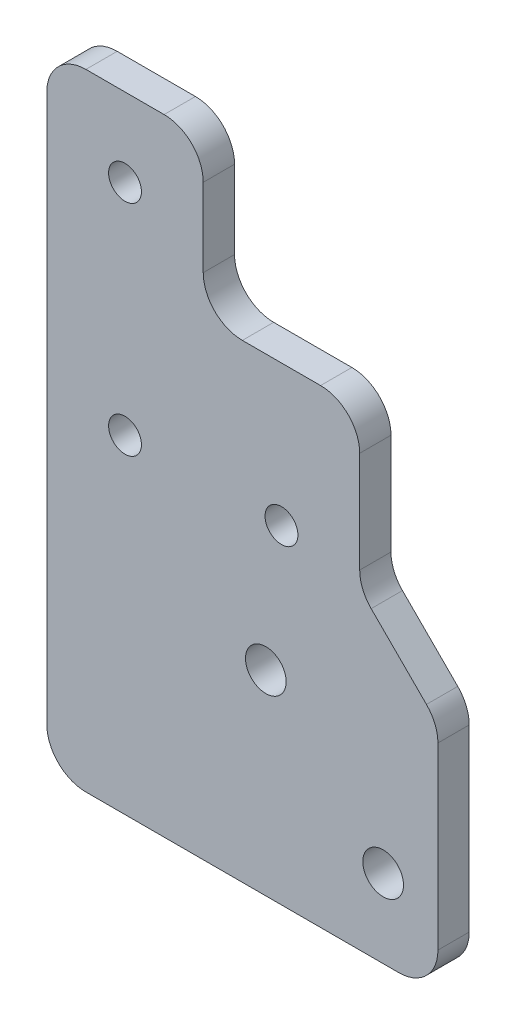
ISO-10303-21;
HEADER;
FILE_DESCRIPTION(('STEP AP214'),'2;1');
FILE_NAME('part.step','',(''),(''),'','','');
FILE_SCHEMA(('AUTOMOTIVE_DESIGN { 1 0 10303 214 1 1 1 1 }'));
ENDSEC;
DATA;
#1=APPLICATION_CONTEXT('core data for automotive mechanical design processes');
#2=APPLICATION_PROTOCOL_DEFINITION('international standard','automotive_design',2000,#1);
#3=PRODUCT_CONTEXT('',#1,'mechanical');
#4=PRODUCT('Part','Part','',(#3));
#5=PRODUCT_RELATED_PRODUCT_CATEGORY('part','',(#4));
#6=PRODUCT_DEFINITION_FORMATION('','',#4);
#7=PRODUCT_DEFINITION_CONTEXT('part definition',#1,'design');
#8=PRODUCT_DEFINITION('design','',#6,#7);
#9=PRODUCT_DEFINITION_SHAPE('','',#8);
#10=(LENGTH_UNIT() NAMED_UNIT(*) SI_UNIT(.MILLI.,.METRE.));
#11=(NAMED_UNIT(*) PLANE_ANGLE_UNIT() SI_UNIT($,.RADIAN.));
#12=(NAMED_UNIT(*) SI_UNIT($,.STERADIAN.) SOLID_ANGLE_UNIT());
#13=UNCERTAINTY_MEASURE_WITH_UNIT(LENGTH_MEASURE(1.E-05),#10,'distance_accuracy_value','');
#14=(GEOMETRIC_REPRESENTATION_CONTEXT(3) GLOBAL_UNCERTAINTY_ASSIGNED_CONTEXT((#13)) GLOBAL_UNIT_ASSIGNED_CONTEXT((#10,
#11,#12)) REPRESENTATION_CONTEXT('',''));
#15=CARTESIAN_POINT('',(0.,0.,0.));
#16=DIRECTION('',(0.,0.,1.));
#17=DIRECTION('',(1.,0.,0.));
#18=AXIS2_PLACEMENT_3D('',#15,#16,#17);
#19=CARTESIAN_POINT('',(303.392668054906,210.464832693422,4.));
#20=DIRECTION('',(0.,0.,1.));
#21=DIRECTION('',(1.,0.,0.));
#22=AXIS2_PLACEMENT_3D('',#19,#20,#21);
#23=PLANE('',#22);
#24=CARTESIAN_POINT('',(268.392738054906,247.464758693422,4.));
#25=DIRECTION('',(0.,0.,1.));
#26=DIRECTION('',(1.,0.,0.));
#27=AXIS2_PLACEMENT_3D('',#24,#25,#26);
#28=CIRCLE('',#27,2.09999579999998);
#29=CARTESIAN_POINT('',(270.492733854906,247.464758693422,4.));
#30=VERTEX_POINT('',#29);
#31=EDGE_CURVE('E348',#30,#30,#28,.T.);
#32=ORIENTED_EDGE('',*,*,#31,.F.);
#33=EDGE_LOOP('',(#32));
#34=FACE_BOUND('',#33,.T.);
#35=CARTESIAN_POINT('',(301.392672054905,215.464822693422,4.));
#36=DIRECTION('',(0.,0.,1.));
#37=DIRECTION('',(1.,0.,0.));
#38=AXIS2_PLACEMENT_3D('',#35,#36,#37);
#39=CIRCLE('',#38,2.59999480000001);
#40=CARTESIAN_POINT('',(303.992666854905,215.464822693422,4.));
#41=VERTEX_POINT('',#40);
#42=EDGE_CURVE('E360',#41,#41,#39,.T.);
#43=ORIENTED_EDGE('',*,*,#42,.F.);
#44=EDGE_LOOP('',(#43));
#45=FACE_BOUND('',#44,.T.);
#46=CARTESIAN_POINT('',(303.392668054906,210.464832693422,4.));
#47=DIRECTION('',(0.,0.,1.));
#48=DIRECTION('',(1.,0.,0.));
#49=AXIS2_PLACEMENT_3D('',#46,#47,#48);
#50=CIRCLE('',#49,4.99998999999995);
#51=CARTESIAN_POINT('',(303.392668054906,205.464842693423,4.));
#52=VERTEX_POINT('',#51);
#53=CARTESIAN_POINT('',(308.392658054906,210.464832693418,4.));
#54=VERTEX_POINT('',#53);
#55=EDGE_CURVE('E210',#52,#54,#50,.T.);
#56=ORIENTED_EDGE('',*,*,#55,.T.);
#57=DIRECTION('',(0.,1.,0.));
#58=VECTOR('',#57,1.);
#59=CARTESIAN_POINT('',(308.392658054906,233.393719023687,4.));
#60=LINE('',#59,#58);
#61=CARTESIAN_POINT('',(308.392658054906,233.393719023687,4.));
#62=VERTEX_POINT('',#61);
#63=EDGE_CURVE('E118',#54,#62,#60,.T.);
#64=ORIENTED_EDGE('',*,*,#63,.T.);
#65=CARTESIAN_POINT('',(303.392668054906,233.393719023687,4.));
#66=DIRECTION('',(0.,0.,1.));
#67=DIRECTION('',(1.,0.,0.));
#68=AXIS2_PLACEMENT_3D('',#65,#66,#67);
#69=CIRCLE('',#68,4.99998999999919);
#70=CARTESIAN_POINT('',(306.928194889771,236.929245858551,4.));
#71=VERTEX_POINT('',#70);
#72=EDGE_CURVE('E249',#62,#71,#69,.T.);
#73=ORIENTED_EDGE('',*,*,#72,.T.);
#74=DIRECTION('',(-0.707106781186549,0.707106781186546,0.));
#75=VECTOR('',#74,1.);
#76=CARTESIAN_POINT('',(299.857141220039,244.000299528283,4.));
#77=LINE('',#76,#75);
#78=CARTESIAN_POINT('',(299.85714122004,244.000299528283,4.));
#79=VERTEX_POINT('',#78);
#80=EDGE_CURVE('E268',#71,#79,#77,.T.);
#81=ORIENTED_EDGE('',*,*,#80,.T.);
#82=CARTESIAN_POINT('',(303.392668054899,247.535826363151,4.));
#83=DIRECTION('',(0.,0.,-1.));
#84=DIRECTION('',(1.,0.,0.));
#85=AXIS2_PLACEMENT_3D('',#82,#83,#84);
#86=CIRCLE('',#85,4.9999899999986);
#87=CARTESIAN_POINT('',(298.392678054901,247.535826363161,4.));
#88=VERTEX_POINT('',#87);
#89=EDGE_CURVE('E265',#79,#88,#86,.T.);
#90=ORIENTED_EDGE('',*,*,#89,.T.);
#91=DIRECTION('',(0.,1.,0.));
#92=VECTOR('',#91,1.);
#93=CARTESIAN_POINT('',(298.392678054901,260.46473269343,4.));
#94=LINE('',#93,#92);
#95=CARTESIAN_POINT('',(298.392678054901,260.46473269343,4.));
#96=VERTEX_POINT('',#95);
#97=EDGE_CURVE('E267',#88,#96,#94,.T.);
#98=ORIENTED_EDGE('',*,*,#97,.T.);
#99=CARTESIAN_POINT('',(293.392688054901,260.464732693422,4.));
#100=DIRECTION('',(0.,0.,1.));
#101=DIRECTION('',(1.,0.,0.));
#102=AXIS2_PLACEMENT_3D('',#99,#100,#101);
#103=CIRCLE('',#102,4.99998999999995);
#104=CARTESIAN_POINT('',(293.392688054901,265.464722693421,4.));
#105=VERTEX_POINT('',#104);
#106=EDGE_CURVE('E270',#96,#105,#103,.T.);
#107=ORIENTED_EDGE('',*,*,#106,.T.);
#108=DIRECTION('',(-1.,0.,0.));
#109=VECTOR('',#108,1.);
#110=CARTESIAN_POINT('',(283.392708054901,265.464722693421,4.));
#111=LINE('',#110,#109);
#112=CARTESIAN_POINT('',(283.392708054901,265.464722693421,4.));
#113=VERTEX_POINT('',#112);
#114=EDGE_CURVE('E276',#105,#113,#111,.T.);
#115=ORIENTED_EDGE('',*,*,#114,.T.);
#116=CARTESIAN_POINT('',(283.392708054901,270.464712693421,4.));
#117=DIRECTION('',(0.,0.,-1.));
#118=DIRECTION('',(1.,0.,0.));
#119=AXIS2_PLACEMENT_3D('',#116,#117,#118);
#120=CIRCLE('',#119,4.9999899999999);
#121=CARTESIAN_POINT('',(278.392718054901,270.464712693421,4.));
#122=VERTEX_POINT('',#121);
#123=EDGE_CURVE('E278',#113,#122,#120,.T.);
#124=ORIENTED_EDGE('',*,*,#123,.T.);
#125=DIRECTION('',(0.,1.,0.));
#126=VECTOR('',#125,1.);
#127=CARTESIAN_POINT('',(278.392718054901,280.464692693422,4.));
#128=LINE('',#127,#126);
#129=CARTESIAN_POINT('',(278.392718054901,280.464692693422,4.));
#130=VERTEX_POINT('',#129);
#131=EDGE_CURVE('E280',#122,#130,#128,.T.);
#132=ORIENTED_EDGE('',*,*,#131,.T.);
#133=CARTESIAN_POINT('',(273.392728054901,280.464692693422,4.));
#134=DIRECTION('',(0.,0.,1.));
#135=DIRECTION('',(1.,0.,0.));
#136=AXIS2_PLACEMENT_3D('',#133,#134,#135);
#137=CIRCLE('',#136,4.99999000000001);
#138=CARTESIAN_POINT('',(273.392728054901,285.464682693422,4.));
#139=VERTEX_POINT('',#138);
#140=EDGE_CURVE('E282',#130,#139,#137,.T.);
#141=ORIENTED_EDGE('',*,*,#140,.T.);
#142=DIRECTION('',(-1.,0.,0.));
#143=VECTOR('',#142,1.);
#144=CARTESIAN_POINT('',(263.392748054902,285.464682693422,4.));
#145=LINE('',#144,#143);
#146=CARTESIAN_POINT('',(263.392748054902,285.464682693422,4.));
#147=VERTEX_POINT('',#146);
#148=EDGE_CURVE('E284',#139,#147,#145,.T.);
#149=ORIENTED_EDGE('',*,*,#148,.T.);
#150=CARTESIAN_POINT('',(263.392748054906,280.464692693422,4.));
#151=DIRECTION('',(0.,0.,1.));
#152=DIRECTION('',(1.,0.,0.));
#153=AXIS2_PLACEMENT_3D('',#150,#151,#152);
#154=CIRCLE('',#153,4.99999000000004);
#155=CARTESIAN_POINT('',(258.392758054906,280.464692693422,4.));
#156=VERTEX_POINT('',#155);
#157=EDGE_CURVE('E161',#147,#156,#154,.T.);
#158=ORIENTED_EDGE('',*,*,#157,.T.);
#159=DIRECTION('',(0.,-1.,0.));
#160=VECTOR('',#159,1.);
#161=CARTESIAN_POINT('',(258.392758054905,210.464832693422,4.));
#162=LINE('',#161,#160);
#163=CARTESIAN_POINT('',(258.392758054905,210.464832693422,4.));
#164=VERTEX_POINT('',#163);
#165=EDGE_CURVE('E155',#156,#164,#162,.T.);
#166=ORIENTED_EDGE('',*,*,#165,.T.);
#167=CARTESIAN_POINT('',(263.392748054905,210.464832693422,4.));
#168=DIRECTION('',(0.,0.,1.));
#169=DIRECTION('',(1.,0.,0.));
#170=AXIS2_PLACEMENT_3D('',#167,#168,#169);
#171=CIRCLE('',#170,4.99999000000007);
#172=CARTESIAN_POINT('',(263.392748054905,205.464842693422,4.));
#173=VERTEX_POINT('',#172);
#174=EDGE_CURVE('E159',#164,#173,#171,.T.);
#175=ORIENTED_EDGE('',*,*,#174,.T.);
#176=DIRECTION('',(1.,0.,0.));
#177=VECTOR('',#176,1.);
#178=CARTESIAN_POINT('',(303.392668054906,205.464842693423,4.));
#179=LINE('',#178,#177);
#180=EDGE_CURVE('E51',#173,#52,#179,.T.);
#181=ORIENTED_EDGE('',*,*,#180,.T.);
#182=EDGE_LOOP('',(#56,#64,#73,#81,#90,#98,#107,#115,#124,#132,#141,#149,#158,#166,#175,#181));
#183=FACE_BOUND('',#182,.T.);
#184=CARTESIAN_POINT('',(286.392702054905,230.464792693422,4.));
#185=DIRECTION('',(0.,0.,1.));
#186=DIRECTION('',(1.,0.,0.));
#187=AXIS2_PLACEMENT_3D('',#184,#185,#186);
#188=CIRCLE('',#187,2.59999480000001);
#189=CARTESIAN_POINT('',(288.992696854905,230.464792693422,4.));
#190=VERTEX_POINT('',#189);
#191=EDGE_CURVE('E183',#190,#190,#188,.T.);
#192=ORIENTED_EDGE('',*,*,#191,.F.);
#193=EDGE_LOOP('',(#192));
#194=FACE_BOUND('',#193,.T.);
#195=CARTESIAN_POINT('',(268.392738054906,275.464702693422,4.));
#196=DIRECTION('',(0.,0.,1.));
#197=DIRECTION('',(1.,0.,0.));
#198=AXIS2_PLACEMENT_3D('',#195,#196,#197);
#199=CIRCLE('',#198,2.09999579999998);
#200=CARTESIAN_POINT('',(270.492733854906,275.464702693422,4.));
#201=VERTEX_POINT('',#200);
#202=EDGE_CURVE('E354',#201,#201,#199,.T.);
#203=ORIENTED_EDGE('',*,*,#202,.F.);
#204=EDGE_LOOP('',(#203));
#205=FACE_BOUND('',#204,.T.);
#206=CARTESIAN_POINT('',(288.392698054905,247.464758693422,4.));
#207=DIRECTION('',(0.,0.,1.));
#208=DIRECTION('',(1.,0.,0.));
#209=AXIS2_PLACEMENT_3D('',#206,#207,#208);
#210=CIRCLE('',#209,2.09999579999998);
#211=CARTESIAN_POINT('',(290.492693854905,247.464758693422,4.));
#212=VERTEX_POINT('',#211);
#213=EDGE_CURVE('E339',#212,#212,#210,.T.);
#214=ORIENTED_EDGE('',*,*,#213,.F.);
#215=EDGE_LOOP('',(#214));
#216=FACE_BOUND('',#215,.T.);
#217=ADVANCED_FACE('F34',(#34,#45,#183,#194,#205,#216),#23,.T.);
#218=CARTESIAN_POINT('',(303.392668054906,210.464832693422,0.));
#219=DIRECTION('',(0.,0.,1.));
#220=DIRECTION('',(1.,0.,0.));
#221=AXIS2_PLACEMENT_3D('',#218,#219,#220);
#222=PLANE('',#221);
#223=CARTESIAN_POINT('',(303.392668054906,210.464832693422,0.));
#224=DIRECTION('',(0.,0.,1.));
#225=DIRECTION('',(1.,0.,0.));
#226=AXIS2_PLACEMENT_3D('',#223,#224,#225);
#227=CIRCLE('',#226,4.99998999999995);
#228=CARTESIAN_POINT('',(303.392668054906,205.464842693423,0.));
#229=VERTEX_POINT('',#228);
#230=CARTESIAN_POINT('',(308.392658054906,210.464832693418,0.));
#231=VERTEX_POINT('',#230);
#232=EDGE_CURVE('E179',#229,#231,#227,.T.);
#233=ORIENTED_EDGE('',*,*,#232,.F.);
#234=DIRECTION('',(1.,0.,0.));
#235=VECTOR('',#234,1.);
#236=CARTESIAN_POINT('',(303.392668054906,205.464842693423,0.));
#237=LINE('',#236,#235);
#238=CARTESIAN_POINT('',(263.392748054905,205.464842693422,0.));
#239=VERTEX_POINT('',#238);
#240=EDGE_CURVE('E110',#239,#229,#237,.T.);
#241=ORIENTED_EDGE('',*,*,#240,.F.);
#242=CARTESIAN_POINT('',(263.392748054905,210.464832693422,0.));
#243=DIRECTION('',(0.,0.,1.));
#244=DIRECTION('',(1.,0.,0.));
#245=AXIS2_PLACEMENT_3D('',#242,#243,#244);
#246=CIRCLE('',#245,4.99999000000007);
#247=CARTESIAN_POINT('',(258.392758054905,210.464832693422,0.));
#248=VERTEX_POINT('',#247);
#249=EDGE_CURVE('E104',#248,#239,#246,.T.);
#250=ORIENTED_EDGE('',*,*,#249,.F.);
#251=DIRECTION('',(0.,-1.,0.));
#252=VECTOR('',#251,1.);
#253=CARTESIAN_POINT('',(258.392758054905,210.464832693422,0.));
#254=LINE('',#253,#252);
#255=CARTESIAN_POINT('',(258.392758054906,280.464692693422,0.));
#256=VERTEX_POINT('',#255);
#257=EDGE_CURVE('E169',#256,#248,#254,.T.);
#258=ORIENTED_EDGE('',*,*,#257,.F.);
#259=CARTESIAN_POINT('',(263.392748054906,280.464692693422,0.));
#260=DIRECTION('',(0.,0.,1.));
#261=DIRECTION('',(1.,0.,0.));
#262=AXIS2_PLACEMENT_3D('',#259,#260,#261);
#263=CIRCLE('',#262,4.99999000000004);
#264=CARTESIAN_POINT('',(263.392748054902,285.464682693422,0.));
#265=VERTEX_POINT('',#264);
#266=EDGE_CURVE('E205',#265,#256,#263,.T.);
#267=ORIENTED_EDGE('',*,*,#266,.F.);
#268=DIRECTION('',(-1.,0.,0.));
#269=VECTOR('',#268,1.);
#270=CARTESIAN_POINT('',(263.392748054902,285.464682693422,0.));
#271=LINE('',#270,#269);
#272=CARTESIAN_POINT('',(273.392728054901,285.464682693422,0.));
#273=VERTEX_POINT('',#272);
#274=EDGE_CURVE('E203',#273,#265,#271,.T.);
#275=ORIENTED_EDGE('',*,*,#274,.F.);
#276=CARTESIAN_POINT('',(273.392728054901,280.464692693422,0.));
#277=DIRECTION('',(0.,0.,1.));
#278=DIRECTION('',(1.,0.,0.));
#279=AXIS2_PLACEMENT_3D('',#276,#277,#278);
#280=CIRCLE('',#279,4.99999000000001);
#281=CARTESIAN_POINT('',(278.392718054901,280.464692693422,0.));
#282=VERTEX_POINT('',#281);
#283=EDGE_CURVE('E201',#282,#273,#280,.T.);
#284=ORIENTED_EDGE('',*,*,#283,.F.);
#285=DIRECTION('',(0.,1.,0.));
#286=VECTOR('',#285,1.);
#287=CARTESIAN_POINT('',(278.392718054901,280.464692693422,0.));
#288=LINE('',#287,#286);
#289=CARTESIAN_POINT('',(278.392718054901,270.464712693421,0.));
#290=VERTEX_POINT('',#289);
#291=EDGE_CURVE('E199',#290,#282,#288,.T.);
#292=ORIENTED_EDGE('',*,*,#291,.F.);
#293=CARTESIAN_POINT('',(283.392708054901,270.464712693421,0.));
#294=DIRECTION('',(0.,0.,-1.));
#295=DIRECTION('',(1.,0.,0.));
#296=AXIS2_PLACEMENT_3D('',#293,#294,#295);
#297=CIRCLE('',#296,4.9999899999999);
#298=CARTESIAN_POINT('',(283.392708054901,265.464722693421,0.));
#299=VERTEX_POINT('',#298);
#300=EDGE_CURVE('E197',#299,#290,#297,.T.);
#301=ORIENTED_EDGE('',*,*,#300,.F.);
#302=DIRECTION('',(-1.,0.,0.));
#303=VECTOR('',#302,1.);
#304=CARTESIAN_POINT('',(283.392708054901,265.464722693421,0.));
#305=LINE('',#304,#303);
#306=CARTESIAN_POINT('',(293.392688054901,265.464722693421,0.));
#307=VERTEX_POINT('',#306);
#308=EDGE_CURVE('E195',#307,#299,#305,.T.);
#309=ORIENTED_EDGE('',*,*,#308,.F.);
#310=CARTESIAN_POINT('',(293.392688054901,260.464732693422,0.));
#311=DIRECTION('',(0.,0.,1.));
#312=DIRECTION('',(1.,0.,0.));
#313=AXIS2_PLACEMENT_3D('',#310,#311,#312);
#314=CIRCLE('',#313,4.99998999999995);
#315=CARTESIAN_POINT('',(298.392678054901,260.46473269343,0.));
#316=VERTEX_POINT('',#315);
#317=EDGE_CURVE('E193',#316,#307,#314,.T.);
#318=ORIENTED_EDGE('',*,*,#317,.F.);
#319=DIRECTION('',(0.,1.,0.));
#320=VECTOR('',#319,1.);
#321=CARTESIAN_POINT('',(298.392678054901,260.46473269343,0.));
#322=LINE('',#321,#320);
#323=CARTESIAN_POINT('',(298.392678054901,247.535826363161,0.));
#324=VERTEX_POINT('',#323);
#325=EDGE_CURVE('E191',#324,#316,#322,.T.);
#326=ORIENTED_EDGE('',*,*,#325,.F.);
#327=CARTESIAN_POINT('',(303.392668054899,247.535826363151,0.));
#328=DIRECTION('',(0.,0.,-1.));
#329=DIRECTION('',(1.,0.,0.));
#330=AXIS2_PLACEMENT_3D('',#327,#328,#329);
#331=CIRCLE('',#330,4.9999899999986);
#332=CARTESIAN_POINT('',(299.85714122004,244.000299528283,0.));
#333=VERTEX_POINT('',#332);
#334=EDGE_CURVE('E189',#333,#324,#331,.T.);
#335=ORIENTED_EDGE('',*,*,#334,.F.);
#336=DIRECTION('',(-0.707106781186549,0.707106781186546,0.));
#337=VECTOR('',#336,1.);
#338=CARTESIAN_POINT('',(299.857141220039,244.000299528283,0.));
#339=LINE('',#338,#337);
#340=CARTESIAN_POINT('',(306.928194889771,236.929245858551,0.));
#341=VERTEX_POINT('',#340);
#342=EDGE_CURVE('E187',#341,#333,#339,.T.);
#343=ORIENTED_EDGE('',*,*,#342,.F.);
#344=CARTESIAN_POINT('',(303.392668054906,233.393719023687,0.));
#345=DIRECTION('',(0.,0.,1.));
#346=DIRECTION('',(1.,0.,0.));
#347=AXIS2_PLACEMENT_3D('',#344,#345,#346);
#348=CIRCLE('',#347,4.99998999999919);
#349=CARTESIAN_POINT('',(308.392658054906,233.393719023687,0.));
#350=VERTEX_POINT('',#349);
#351=EDGE_CURVE('E185',#350,#341,#348,.T.);
#352=ORIENTED_EDGE('',*,*,#351,.F.);
#353=DIRECTION('',(0.,1.,0.));
#354=VECTOR('',#353,1.);
#355=CARTESIAN_POINT('',(308.392658054906,233.393719023687,0.));
#356=LINE('',#355,#354);
#357=EDGE_CURVE('E182',#231,#350,#356,.T.);
#358=ORIENTED_EDGE('',*,*,#357,.F.);
#359=EDGE_LOOP('',(#233,#241,#250,#258,#267,#275,#284,#292,#301,#309,#318,#326,#335,#343,#352,#358));
#360=FACE_BOUND('',#359,.T.);
#361=CARTESIAN_POINT('',(286.392702054905,230.464792693422,0.));
#362=DIRECTION('',(0.,0.,1.));
#363=DIRECTION('',(1.,0.,0.));
#364=AXIS2_PLACEMENT_3D('',#361,#362,#363);
#365=CIRCLE('',#364,2.59999480000001);
#366=CARTESIAN_POINT('',(288.992696854905,230.464792693422,0.));
#367=VERTEX_POINT('',#366);
#368=EDGE_CURVE('E363',#367,#367,#365,.T.);
#369=ORIENTED_EDGE('',*,*,#368,.T.);
#370=EDGE_LOOP('',(#369));
#371=FACE_BOUND('',#370,.T.);
#372=CARTESIAN_POINT('',(301.392672054905,215.464822693422,0.));
#373=DIRECTION('',(0.,0.,1.));
#374=DIRECTION('',(1.,0.,0.));
#375=AXIS2_PLACEMENT_3D('',#372,#373,#374);
#376=CIRCLE('',#375,2.59999480000001);
#377=CARTESIAN_POINT('',(303.992666854905,215.464822693422,0.));
#378=VERTEX_POINT('',#377);
#379=EDGE_CURVE('E357',#378,#378,#376,.T.);
#380=ORIENTED_EDGE('',*,*,#379,.T.);
#381=EDGE_LOOP('',(#380));
#382=FACE_BOUND('',#381,.T.);
#383=CARTESIAN_POINT('',(268.392738054906,275.464702693422,0.));
#384=DIRECTION('',(0.,0.,1.));
#385=DIRECTION('',(1.,0.,0.));
#386=AXIS2_PLACEMENT_3D('',#383,#384,#385);
#387=CIRCLE('',#386,2.09999579999998);
#388=CARTESIAN_POINT('',(270.492733854906,275.464702693422,0.));
#389=VERTEX_POINT('',#388);
#390=EDGE_CURVE('E351',#389,#389,#387,.T.);
#391=ORIENTED_EDGE('',*,*,#390,.T.);
#392=EDGE_LOOP('',(#391));
#393=FACE_BOUND('',#392,.T.);
#394=CARTESIAN_POINT('',(268.392738054906,247.464758693422,0.));
#395=DIRECTION('',(0.,0.,1.));
#396=DIRECTION('',(1.,0.,0.));
#397=AXIS2_PLACEMENT_3D('',#394,#395,#396);
#398=CIRCLE('',#397,2.09999579999998);
#399=CARTESIAN_POINT('',(270.492733854906,247.464758693422,0.));
#400=VERTEX_POINT('',#399);
#401=EDGE_CURVE('E345',#400,#400,#398,.T.);
#402=ORIENTED_EDGE('',*,*,#401,.T.);
#403=EDGE_LOOP('',(#402));
#404=FACE_BOUND('',#403,.T.);
#405=CARTESIAN_POINT('',(288.392698054905,247.464758693422,0.));
#406=DIRECTION('',(0.,0.,1.));
#407=DIRECTION('',(1.,0.,0.));
#408=AXIS2_PLACEMENT_3D('',#405,#406,#407);
#409=CIRCLE('',#408,2.09999579999998);
#410=CARTESIAN_POINT('',(290.492693854905,247.464758693422,0.));
#411=VERTEX_POINT('',#410);
#412=EDGE_CURVE('E342',#411,#411,#409,.T.);
#413=ORIENTED_EDGE('',*,*,#412,.T.);
#414=EDGE_LOOP('',(#413));
#415=FACE_BOUND('',#414,.T.);
#416=ADVANCED_FACE('F253',(#360,#371,#382,#393,#404,#415),#222,.F.);
#417=CARTESIAN_POINT('',(303.392668054906,210.464832693422,4.));
#418=DIRECTION('',(0.,0.,-1.));
#419=DIRECTION('',(-1.,0.,0.));
#420=AXIS2_PLACEMENT_3D('',#417,#418,#419);
#421=CYLINDRICAL_SURFACE('',#420,4.99998999999995);
#422=ORIENTED_EDGE('',*,*,#232,.T.);
#423=DIRECTION('',(0.,0.,-1.));
#424=VECTOR('',#423,1.);
#425=CARTESIAN_POINT('',(308.392658054906,210.464832693418,4.));
#426=LINE('',#425,#424);
#427=EDGE_CURVE('E11',#54,#231,#426,.T.);
#428=ORIENTED_EDGE('',*,*,#427,.F.);
#429=ORIENTED_EDGE('',*,*,#55,.F.);
#430=DIRECTION('',(0.,0.,-1.));
#431=VECTOR('',#430,1.);
#432=CARTESIAN_POINT('',(303.392668054906,205.464842693423,4.));
#433=LINE('',#432,#431);
#434=EDGE_CURVE('E175',#52,#229,#433,.T.);
#435=ORIENTED_EDGE('',*,*,#434,.T.);
#436=EDGE_LOOP('',(#422,#428,#429,#435));
#437=FACE_BOUND('',#436,.T.);
#438=ADVANCED_FACE('F36',(#437),#421,.T.);
#439=CARTESIAN_POINT('',(308.392658054906,233.393719023687,4.));
#440=DIRECTION('',(-1.,0.,0.));
#441=DIRECTION('',(0.,0.,1.));
#442=AXIS2_PLACEMENT_3D('',#439,#440,#441);
#443=PLANE('',#442);
#444=ORIENTED_EDGE('',*,*,#357,.T.);
#445=DIRECTION('',(0.,0.,-1.));
#446=VECTOR('',#445,1.);
#447=CARTESIAN_POINT('',(308.392658054906,233.393719023687,4.));
#448=LINE('',#447,#446);
#449=EDGE_CURVE('E43',#62,#350,#448,.T.);
#450=ORIENTED_EDGE('',*,*,#449,.F.);
#451=ORIENTED_EDGE('',*,*,#63,.F.);
#452=ORIENTED_EDGE('',*,*,#427,.T.);
#453=EDGE_LOOP('',(#444,#450,#451,#452));
#454=FACE_BOUND('',#453,.T.);
#455=ADVANCED_FACE('F522',(#454),#443,.F.);
#456=CARTESIAN_POINT('',(303.392668054906,233.393719023687,4.));
#457=DIRECTION('',(0.,0.,-1.));
#458=DIRECTION('',(-1.,0.,0.));
#459=AXIS2_PLACEMENT_3D('',#456,#457,#458);
#460=CYLINDRICAL_SURFACE('',#459,4.99998999999919);
#461=ORIENTED_EDGE('',*,*,#351,.T.);
#462=DIRECTION('',(0.,0.,-1.));
#463=VECTOR('',#462,1.);
#464=CARTESIAN_POINT('',(306.928194889771,236.929245858551,4.));
#465=LINE('',#464,#463);
#466=EDGE_CURVE('E241',#71,#341,#465,.T.);
#467=ORIENTED_EDGE('',*,*,#466,.F.);
#468=ORIENTED_EDGE('',*,*,#72,.F.);
#469=ORIENTED_EDGE('',*,*,#449,.T.);
#470=EDGE_LOOP('',(#461,#467,#468,#469));
#471=FACE_BOUND('',#470,.T.);
#472=ADVANCED_FACE('F247',(#471),#460,.T.);
#473=CARTESIAN_POINT('',(299.857141220039,244.000299528283,4.));
#474=DIRECTION('',(-0.707106781186546,-0.707106781186549,0.));
#475=DIRECTION('',(0.707106781186549,-0.707106781186546,0.));
#476=AXIS2_PLACEMENT_3D('',#473,#474,#475);
#477=PLANE('',#476);
#478=ORIENTED_EDGE('',*,*,#342,.T.);
#479=DIRECTION('',(0.,0.,-1.));
#480=VECTOR('',#479,1.);
#481=CARTESIAN_POINT('',(299.85714122004,244.000299528283,4.));
#482=LINE('',#481,#480);
#483=EDGE_CURVE('E238',#79,#333,#482,.T.);
#484=ORIENTED_EDGE('',*,*,#483,.F.);
#485=ORIENTED_EDGE('',*,*,#80,.F.);
#486=ORIENTED_EDGE('',*,*,#466,.T.);
#487=EDGE_LOOP('',(#478,#484,#485,#486));
#488=FACE_BOUND('',#487,.T.);
#489=ADVANCED_FACE('F259',(#488),#477,.F.);
#490=CARTESIAN_POINT('',(303.392668054899,247.535826363151,4.));
#491=DIRECTION('',(0.,0.,-1.));
#492=DIRECTION('',(-1.,0.,0.));
#493=AXIS2_PLACEMENT_3D('',#490,#491,#492);
#494=CYLINDRICAL_SURFACE('',#493,4.9999899999986);
#495=ORIENTED_EDGE('',*,*,#334,.T.);
#496=DIRECTION('',(0.,0.,-1.));
#497=VECTOR('',#496,1.);
#498=CARTESIAN_POINT('',(298.392678054901,247.535826363161,4.));
#499=LINE('',#498,#497);
#500=EDGE_CURVE('E235',#88,#324,#499,.T.);
#501=ORIENTED_EDGE('',*,*,#500,.F.);
#502=ORIENTED_EDGE('',*,*,#89,.F.);
#503=ORIENTED_EDGE('',*,*,#483,.T.);
#504=EDGE_LOOP('',(#495,#501,#502,#503));
#505=FACE_BOUND('',#504,.T.);
#506=ADVANCED_FACE('F263',(#505),#494,.F.);
#507=CARTESIAN_POINT('',(298.392678054901,260.46473269343,4.));
#508=DIRECTION('',(-1.,0.,0.));
#509=DIRECTION('',(0.,0.,1.));
#510=AXIS2_PLACEMENT_3D('',#507,#508,#509);
#511=PLANE('',#510);
#512=ORIENTED_EDGE('',*,*,#325,.T.);
#513=DIRECTION('',(0.,0.,-1.));
#514=VECTOR('',#513,1.);
#515=CARTESIAN_POINT('',(298.392678054901,260.46473269343,4.));
#516=LINE('',#515,#514);
#517=EDGE_CURVE('E232',#96,#316,#516,.T.);
#518=ORIENTED_EDGE('',*,*,#517,.F.);
#519=ORIENTED_EDGE('',*,*,#97,.F.);
#520=ORIENTED_EDGE('',*,*,#500,.T.);
#521=EDGE_LOOP('',(#512,#518,#519,#520));
#522=FACE_BOUND('',#521,.T.);
#523=ADVANCED_FACE('F487',(#522),#511,.F.);
#524=CARTESIAN_POINT('',(293.392688054901,260.464732693422,4.));
#525=DIRECTION('',(0.,0.,-1.));
#526=DIRECTION('',(-1.,0.,0.));
#527=AXIS2_PLACEMENT_3D('',#524,#525,#526);
#528=CYLINDRICAL_SURFACE('',#527,4.99998999999995);
#529=ORIENTED_EDGE('',*,*,#317,.T.);
#530=DIRECTION('',(0.,0.,-1.));
#531=VECTOR('',#530,1.);
#532=CARTESIAN_POINT('',(293.392688054901,265.464722693421,4.));
#533=LINE('',#532,#531);
#534=EDGE_CURVE('E229',#105,#307,#533,.T.);
#535=ORIENTED_EDGE('',*,*,#534,.F.);
#536=ORIENTED_EDGE('',*,*,#106,.F.);
#537=ORIENTED_EDGE('',*,*,#517,.T.);
#538=EDGE_LOOP('',(#529,#535,#536,#537));
#539=FACE_BOUND('',#538,.T.);
#540=ADVANCED_FACE('F477',(#539),#528,.T.);
#541=CARTESIAN_POINT('',(283.392708054901,265.464722693421,4.));
#542=DIRECTION('',(0.,-1.,0.));
#543=DIRECTION('',(0.,0.,-1.));
#544=AXIS2_PLACEMENT_3D('',#541,#542,#543);
#545=PLANE('',#544);
#546=ORIENTED_EDGE('',*,*,#308,.T.);
#547=DIRECTION('',(0.,0.,-1.));
#548=VECTOR('',#547,1.);
#549=CARTESIAN_POINT('',(283.392708054901,265.464722693421,4.));
#550=LINE('',#549,#548);
#551=EDGE_CURVE('E226',#113,#299,#550,.T.);
#552=ORIENTED_EDGE('',*,*,#551,.F.);
#553=ORIENTED_EDGE('',*,*,#114,.F.);
#554=ORIENTED_EDGE('',*,*,#534,.T.);
#555=EDGE_LOOP('',(#546,#552,#553,#554));
#556=FACE_BOUND('',#555,.T.);
#557=ADVANCED_FACE('F467',(#556),#545,.F.);
#558=CARTESIAN_POINT('',(283.392708054901,270.464712693421,4.));
#559=DIRECTION('',(0.,0.,-1.));
#560=DIRECTION('',(-1.,0.,0.));
#561=AXIS2_PLACEMENT_3D('',#558,#559,#560);
#562=CYLINDRICAL_SURFACE('',#561,4.9999899999999);
#563=ORIENTED_EDGE('',*,*,#300,.T.);
#564=DIRECTION('',(0.,0.,-1.));
#565=VECTOR('',#564,1.);
#566=CARTESIAN_POINT('',(278.392718054901,270.464712693421,4.));
#567=LINE('',#566,#565);
#568=EDGE_CURVE('E223',#122,#290,#567,.T.);
#569=ORIENTED_EDGE('',*,*,#568,.F.);
#570=ORIENTED_EDGE('',*,*,#123,.F.);
#571=ORIENTED_EDGE('',*,*,#551,.T.);
#572=EDGE_LOOP('',(#563,#569,#570,#571));
#573=FACE_BOUND('',#572,.T.);
#574=ADVANCED_FACE('F457',(#573),#562,.F.);
#575=CARTESIAN_POINT('',(278.392718054901,280.464692693422,4.));
#576=DIRECTION('',(-1.,0.,0.));
#577=DIRECTION('',(0.,0.,1.));
#578=AXIS2_PLACEMENT_3D('',#575,#576,#577);
#579=PLANE('',#578);
#580=ORIENTED_EDGE('',*,*,#291,.T.);
#581=DIRECTION('',(0.,0.,-1.));
#582=VECTOR('',#581,1.);
#583=CARTESIAN_POINT('',(278.392718054901,280.464692693422,4.));
#584=LINE('',#583,#582);
#585=EDGE_CURVE('E220',#130,#282,#584,.T.);
#586=ORIENTED_EDGE('',*,*,#585,.F.);
#587=ORIENTED_EDGE('',*,*,#131,.F.);
#588=ORIENTED_EDGE('',*,*,#568,.T.);
#589=EDGE_LOOP('',(#580,#586,#587,#588));
#590=FACE_BOUND('',#589,.T.);
#591=ADVANCED_FACE('F447',(#590),#579,.F.);
#592=CARTESIAN_POINT('',(273.392728054901,280.464692693422,4.));
#593=DIRECTION('',(0.,0.,-1.));
#594=DIRECTION('',(-1.,0.,0.));
#595=AXIS2_PLACEMENT_3D('',#592,#593,#594);
#596=CYLINDRICAL_SURFACE('',#595,4.99999000000001);
#597=ORIENTED_EDGE('',*,*,#283,.T.);
#598=DIRECTION('',(0.,0.,-1.));
#599=VECTOR('',#598,1.);
#600=CARTESIAN_POINT('',(273.392728054901,285.464682693422,4.));
#601=LINE('',#600,#599);
#602=EDGE_CURVE('E217',#139,#273,#601,.T.);
#603=ORIENTED_EDGE('',*,*,#602,.F.);
#604=ORIENTED_EDGE('',*,*,#140,.F.);
#605=ORIENTED_EDGE('',*,*,#585,.T.);
#606=EDGE_LOOP('',(#597,#603,#604,#605));
#607=FACE_BOUND('',#606,.T.);
#608=ADVANCED_FACE('F438',(#607),#596,.T.);
#609=CARTESIAN_POINT('',(263.392748054902,285.464682693422,4.));
#610=DIRECTION('',(0.,-1.,0.));
#611=DIRECTION('',(0.,0.,-1.));
#612=AXIS2_PLACEMENT_3D('',#609,#610,#611);
#613=PLANE('',#612);
#614=ORIENTED_EDGE('',*,*,#274,.T.);
#615=DIRECTION('',(0.,0.,-1.));
#616=VECTOR('',#615,1.);
#617=CARTESIAN_POINT('',(263.392748054902,285.464682693422,4.));
#618=LINE('',#617,#616);
#619=EDGE_CURVE('E214',#147,#265,#618,.T.);
#620=ORIENTED_EDGE('',*,*,#619,.F.);
#621=ORIENTED_EDGE('',*,*,#148,.F.);
#622=ORIENTED_EDGE('',*,*,#602,.T.);
#623=EDGE_LOOP('',(#614,#620,#621,#622));
#624=FACE_BOUND('',#623,.T.);
#625=ADVANCED_FACE('F290',(#624),#613,.F.);
#626=CARTESIAN_POINT('',(263.392748054906,280.464692693422,4.));
#627=DIRECTION('',(0.,0.,-1.));
#628=DIRECTION('',(-1.,0.,0.));
#629=AXIS2_PLACEMENT_3D('',#626,#627,#628);
#630=CYLINDRICAL_SURFACE('',#629,4.99999000000004);
#631=ORIENTED_EDGE('',*,*,#266,.T.);
#632=DIRECTION('',(0.,0.,-1.));
#633=VECTOR('',#632,1.);
#634=CARTESIAN_POINT('',(258.392758054906,280.464692693422,4.));
#635=LINE('',#634,#633);
#636=EDGE_CURVE('E170',#156,#256,#635,.T.);
#637=ORIENTED_EDGE('',*,*,#636,.F.);
#638=ORIENTED_EDGE('',*,*,#157,.F.);
#639=ORIENTED_EDGE('',*,*,#619,.T.);
#640=EDGE_LOOP('',(#631,#637,#638,#639));
#641=FACE_BOUND('',#640,.T.);
#642=ADVANCED_FACE('F294',(#641),#630,.T.);
#643=CARTESIAN_POINT('',(258.392758054905,210.464832693422,4.));
#644=DIRECTION('',(1.,0.,0.));
#645=DIRECTION('',(0.,1.,0.));
#646=AXIS2_PLACEMENT_3D('',#643,#644,#645);
#647=PLANE('',#646);
#648=ORIENTED_EDGE('',*,*,#257,.T.);
#649=DIRECTION('',(0.,0.,-1.));
#650=VECTOR('',#649,1.);
#651=CARTESIAN_POINT('',(258.392758054905,210.464832693422,4.));
#652=LINE('',#651,#650);
#653=EDGE_CURVE('E166',#164,#248,#652,.T.);
#654=ORIENTED_EDGE('',*,*,#653,.F.);
#655=ORIENTED_EDGE('',*,*,#165,.F.);
#656=ORIENTED_EDGE('',*,*,#636,.T.);
#657=EDGE_LOOP('',(#648,#654,#655,#656));
#658=FACE_BOUND('',#657,.T.);
#659=ADVANCED_FACE('F167',(#658),#647,.F.);
#660=CARTESIAN_POINT('',(263.392748054905,210.464832693422,4.));
#661=DIRECTION('',(0.,0.,-1.));
#662=DIRECTION('',(-1.,0.,0.));
#663=AXIS2_PLACEMENT_3D('',#660,#661,#662);
#664=CYLINDRICAL_SURFACE('',#663,4.99999000000007);
#665=ORIENTED_EDGE('',*,*,#249,.T.);
#666=DIRECTION('',(0.,0.,-1.));
#667=VECTOR('',#666,1.);
#668=CARTESIAN_POINT('',(263.392748054905,205.464842693422,4.));
#669=LINE('',#668,#667);
#670=EDGE_CURVE('E171',#173,#239,#669,.T.);
#671=ORIENTED_EDGE('',*,*,#670,.F.);
#672=ORIENTED_EDGE('',*,*,#174,.F.);
#673=ORIENTED_EDGE('',*,*,#653,.T.);
#674=EDGE_LOOP('',(#665,#671,#672,#673));
#675=FACE_BOUND('',#674,.T.);
#676=ADVANCED_FACE('F173',(#675),#664,.T.);
#677=CARTESIAN_POINT('',(303.392668054906,205.464842693423,4.));
#678=DIRECTION('',(0.,1.,0.));
#679=DIRECTION('',(-1.,0.,0.));
#680=AXIS2_PLACEMENT_3D('',#677,#678,#679);
#681=PLANE('',#680);
#682=ORIENTED_EDGE('',*,*,#240,.T.);
#683=ORIENTED_EDGE('',*,*,#434,.F.);
#684=ORIENTED_EDGE('',*,*,#180,.F.);
#685=ORIENTED_EDGE('',*,*,#670,.T.);
#686=EDGE_LOOP('',(#682,#683,#684,#685));
#687=FACE_BOUND('',#686,.T.);
#688=ADVANCED_FACE('F298',(#687),#681,.F.);
#689=CARTESIAN_POINT('',(286.392702054905,230.464792693422,4.));
#690=DIRECTION('',(0.,0.,-1.));
#691=DIRECTION('',(-1.,0.,0.));
#692=AXIS2_PLACEMENT_3D('',#689,#690,#691);
#693=CYLINDRICAL_SURFACE('',#692,2.59999480000001);
#694=ORIENTED_EDGE('',*,*,#191,.T.);
#695=EDGE_LOOP('',(#694));
#696=FACE_BOUND('',#695,.T.);
#697=ORIENTED_EDGE('',*,*,#368,.F.);
#698=EDGE_LOOP('',(#697));
#699=FACE_BOUND('',#698,.T.);
#700=ADVANCED_FACE('F300',(#696,#699),#693,.F.);
#701=CARTESIAN_POINT('',(301.392672054905,215.464822693422,4.));
#702=DIRECTION('',(0.,0.,-1.));
#703=DIRECTION('',(-1.,0.,0.));
#704=AXIS2_PLACEMENT_3D('',#701,#702,#703);
#705=CYLINDRICAL_SURFACE('',#704,2.59999480000001);
#706=ORIENTED_EDGE('',*,*,#42,.T.);
#707=EDGE_LOOP('',(#706));
#708=FACE_BOUND('',#707,.T.);
#709=ORIENTED_EDGE('',*,*,#379,.F.);
#710=EDGE_LOOP('',(#709));
#711=FACE_BOUND('',#710,.T.);
#712=ADVANCED_FACE('F306',(#708,#711),#705,.F.);
#713=CARTESIAN_POINT('',(268.392738054906,275.464702693422,4.));
#714=DIRECTION('',(0.,0.,-1.));
#715=DIRECTION('',(-1.,0.,0.));
#716=AXIS2_PLACEMENT_3D('',#713,#714,#715);
#717=CYLINDRICAL_SURFACE('',#716,2.09999579999998);
#718=ORIENTED_EDGE('',*,*,#202,.T.);
#719=EDGE_LOOP('',(#718));
#720=FACE_BOUND('',#719,.T.);
#721=ORIENTED_EDGE('',*,*,#390,.F.);
#722=EDGE_LOOP('',(#721));
#723=FACE_BOUND('',#722,.T.);
#724=ADVANCED_FACE('F322',(#720,#723),#717,.F.);
#725=CARTESIAN_POINT('',(268.392738054906,247.464758693422,4.));
#726=DIRECTION('',(0.,0.,-1.));
#727=DIRECTION('',(-1.,0.,0.));
#728=AXIS2_PLACEMENT_3D('',#725,#726,#727);
#729=CYLINDRICAL_SURFACE('',#728,2.09999579999998);
#730=ORIENTED_EDGE('',*,*,#31,.T.);
#731=EDGE_LOOP('',(#730));
#732=FACE_BOUND('',#731,.T.);
#733=ORIENTED_EDGE('',*,*,#401,.F.);
#734=EDGE_LOOP('',(#733));
#735=FACE_BOUND('',#734,.T.);
#736=ADVANCED_FACE('F326',(#732,#735),#729,.F.);
#737=CARTESIAN_POINT('',(288.392698054905,247.464758693422,4.));
#738=DIRECTION('',(0.,0.,-1.));
#739=DIRECTION('',(-1.,0.,0.));
#740=AXIS2_PLACEMENT_3D('',#737,#738,#739);
#741=CYLINDRICAL_SURFACE('',#740,2.09999579999998);
#742=ORIENTED_EDGE('',*,*,#213,.T.);
#743=EDGE_LOOP('',(#742));
#744=FACE_BOUND('',#743,.T.);
#745=ORIENTED_EDGE('',*,*,#412,.F.);
#746=EDGE_LOOP('',(#745));
#747=FACE_BOUND('',#746,.T.);
#748=ADVANCED_FACE('F330',(#744,#747),#741,.F.);
#749=CLOSED_SHELL('',(#217,#416,#438,#455,#472,#489,#506,#523,#540,#557,#574,#591,#608,#625,
#642,#659,#676,#688,#700,#712,#724,#736,#748));
#750=MANIFOLD_SOLID_BREP('B2',#749);
#751=ADVANCED_BREP_SHAPE_REPRESENTATION('',(#18,#750),#14);
#752=SHAPE_DEFINITION_REPRESENTATION(#9,#751);
ENDSEC;
END-ISO-10303-21;
